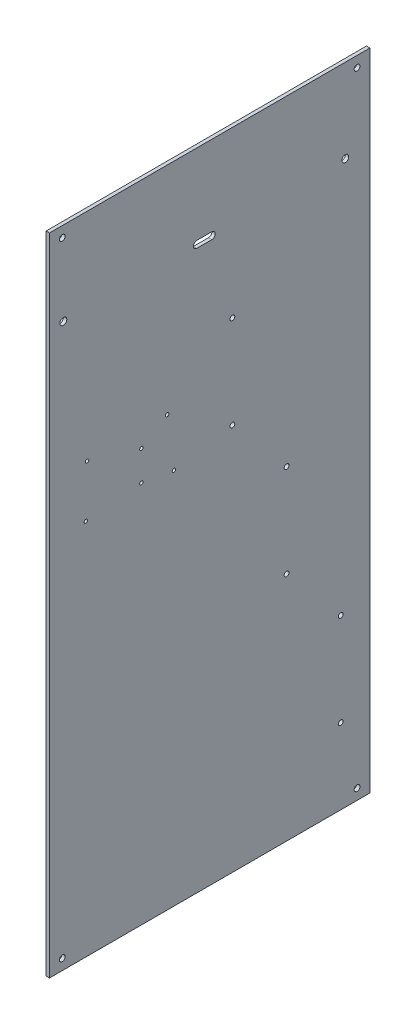
ISO-10303-21;
HEADER;
FILE_DESCRIPTION(('STEP AP214'),'2;1');
FILE_NAME('part.step','',(''),(''),'','','');
FILE_SCHEMA(('AUTOMOTIVE_DESIGN { 1 0 10303 214 1 1 1 1 }'));
ENDSEC;
DATA;
#1=APPLICATION_CONTEXT('core data for automotive mechanical design processes');
#2=APPLICATION_PROTOCOL_DEFINITION('international standard','automotive_design',2000,#1);
#3=PRODUCT_CONTEXT('',#1,'mechanical');
#4=PRODUCT('Part','Part','',(#3));
#5=PRODUCT_RELATED_PRODUCT_CATEGORY('part','',(#4));
#6=PRODUCT_DEFINITION_FORMATION('','',#4);
#7=PRODUCT_DEFINITION_CONTEXT('part definition',#1,'design');
#8=PRODUCT_DEFINITION('design','',#6,#7);
#9=PRODUCT_DEFINITION_SHAPE('','',#8);
#10=(LENGTH_UNIT() NAMED_UNIT(*) SI_UNIT(.MILLI.,.METRE.));
#11=(NAMED_UNIT(*) PLANE_ANGLE_UNIT() SI_UNIT($,.RADIAN.));
#12=(NAMED_UNIT(*) SI_UNIT($,.STERADIAN.) SOLID_ANGLE_UNIT());
#13=UNCERTAINTY_MEASURE_WITH_UNIT(LENGTH_MEASURE(1.E-05),#10,'distance_accuracy_value','');
#14=(GEOMETRIC_REPRESENTATION_CONTEXT(3) GLOBAL_UNCERTAINTY_ASSIGNED_CONTEXT((#13)) GLOBAL_UNIT_ASSIGNED_CONTEXT((#10,
#11,#12)) REPRESENTATION_CONTEXT('',''));
#15=CARTESIAN_POINT('',(0.,0.,0.));
#16=DIRECTION('',(0.,0.,1.));
#17=DIRECTION('',(1.,0.,0.));
#18=AXIS2_PLACEMENT_3D('',#15,#16,#17);
#19=CARTESIAN_POINT('',(-1.5875,-302.1,-150.));
#20=DIRECTION('',(0.,0.,-1.));
#21=DIRECTION('',(-1.,0.,0.));
#22=AXIS2_PLACEMENT_3D('',#19,#20,#21);
#23=PLANE('',#22);
#24=DIRECTION('',(1.,0.,0.));
#25=VECTOR('',#24,1.);
#26=CARTESIAN_POINT('',(-1.5875,302.1,-150.));
#27=LINE('',#26,#25);
#28=CARTESIAN_POINT('',(-1.5875,302.1,-150.));
#29=VERTEX_POINT('',#28);
#30=CARTESIAN_POINT('',(1.5875,302.1,-150.));
#31=VERTEX_POINT('',#30);
#32=EDGE_CURVE('E36',#29,#31,#27,.T.);
#33=ORIENTED_EDGE('',*,*,#32,.T.);
#34=DIRECTION('',(0.,1.,0.));
#35=VECTOR('',#34,1.);
#36=CARTESIAN_POINT('',(1.5875,-302.1,-150.));
#37=LINE('',#36,#35);
#38=CARTESIAN_POINT('',(1.5875,-302.1,-150.));
#39=VERTEX_POINT('',#38);
#40=EDGE_CURVE('E238',#39,#31,#37,.T.);
#41=ORIENTED_EDGE('',*,*,#40,.F.);
#42=DIRECTION('',(1.,0.,0.));
#43=VECTOR('',#42,1.);
#44=CARTESIAN_POINT('',(-1.5875,-302.1,-150.));
#45=LINE('',#44,#43);
#46=CARTESIAN_POINT('',(-1.5875,-302.1,-150.));
#47=VERTEX_POINT('',#46);
#48=EDGE_CURVE('E11',#47,#39,#45,.T.);
#49=ORIENTED_EDGE('',*,*,#48,.F.);
#50=DIRECTION('',(0.,1.,0.));
#51=VECTOR('',#50,1.);
#52=CARTESIAN_POINT('',(-1.5875,-302.1,-150.));
#53=LINE('',#52,#51);
#54=EDGE_CURVE('E250',#47,#29,#53,.T.);
#55=ORIENTED_EDGE('',*,*,#54,.T.);
#56=EDGE_LOOP('',(#33,#41,#49,#55));
#57=FACE_BOUND('',#56,.T.);
#58=ADVANCED_FACE('F33',(#57),#23,.T.);
#59=CARTESIAN_POINT('',(-1.5875,-302.1,150.));
#60=DIRECTION('',(0.,-1.,0.));
#61=DIRECTION('',(0.,0.,-1.));
#62=AXIS2_PLACEMENT_3D('',#59,#60,#61);
#63=PLANE('',#62);
#64=ORIENTED_EDGE('',*,*,#48,.T.);
#65=DIRECTION('',(0.,0.,-1.));
#66=VECTOR('',#65,1.);
#67=CARTESIAN_POINT('',(1.5875,-302.1,150.));
#68=LINE('',#67,#66);
#69=CARTESIAN_POINT('',(1.5875,-302.1,150.));
#70=VERTEX_POINT('',#69);
#71=EDGE_CURVE('E247',#70,#39,#68,.T.);
#72=ORIENTED_EDGE('',*,*,#71,.F.);
#73=DIRECTION('',(1.,0.,0.));
#74=VECTOR('',#73,1.);
#75=CARTESIAN_POINT('',(-1.5875,-302.1,150.));
#76=LINE('',#75,#74);
#77=CARTESIAN_POINT('',(-1.5875,-302.1,150.));
#78=VERTEX_POINT('',#77);
#79=EDGE_CURVE('E41',#78,#70,#76,.T.);
#80=ORIENTED_EDGE('',*,*,#79,.F.);
#81=DIRECTION('',(0.,0.,-1.));
#82=VECTOR('',#81,1.);
#83=CARTESIAN_POINT('',(-1.5875,-302.1,150.));
#84=LINE('',#83,#82);
#85=EDGE_CURVE('E259',#78,#47,#84,.T.);
#86=ORIENTED_EDGE('',*,*,#85,.T.);
#87=EDGE_LOOP('',(#64,#72,#80,#86));
#88=FACE_BOUND('',#87,.T.);
#89=ADVANCED_FACE('F274',(#88),#63,.T.);
#90=CARTESIAN_POINT('',(-1.5875,-302.1,150.));
#91=DIRECTION('',(0.,0.,1.));
#92=DIRECTION('',(1.,0.,0.));
#93=AXIS2_PLACEMENT_3D('',#90,#91,#92);
#94=PLANE('',#93);
#95=ORIENTED_EDGE('',*,*,#79,.T.);
#96=DIRECTION('',(0.,-1.,0.));
#97=VECTOR('',#96,1.);
#98=CARTESIAN_POINT('',(1.5875,-302.1,150.));
#99=LINE('',#98,#97);
#100=CARTESIAN_POINT('',(1.5875,302.1,150.));
#101=VERTEX_POINT('',#100);
#102=EDGE_CURVE('E244',#101,#70,#99,.T.);
#103=ORIENTED_EDGE('',*,*,#102,.F.);
#104=DIRECTION('',(1.,0.,0.));
#105=VECTOR('',#104,1.);
#106=CARTESIAN_POINT('',(-1.5875,302.1,150.));
#107=LINE('',#106,#105);
#108=CARTESIAN_POINT('',(-1.5875,302.1,150.));
#109=VERTEX_POINT('',#108);
#110=EDGE_CURVE('E262',#109,#101,#107,.T.);
#111=ORIENTED_EDGE('',*,*,#110,.F.);
#112=DIRECTION('',(0.,-1.,0.));
#113=VECTOR('',#112,1.);
#114=CARTESIAN_POINT('',(-1.5875,-302.1,150.));
#115=LINE('',#114,#113);
#116=EDGE_CURVE('E256',#109,#78,#115,.T.);
#117=ORIENTED_EDGE('',*,*,#116,.T.);
#118=EDGE_LOOP('',(#95,#103,#111,#117));
#119=FACE_BOUND('',#118,.T.);
#120=ADVANCED_FACE('F280',(#119),#94,.T.);
#121=CARTESIAN_POINT('',(-1.5875,302.1,150.));
#122=DIRECTION('',(0.,1.,0.));
#123=DIRECTION('',(0.,0.,1.));
#124=AXIS2_PLACEMENT_3D('',#121,#122,#123);
#125=PLANE('',#124);
#126=ORIENTED_EDGE('',*,*,#110,.T.);
#127=DIRECTION('',(0.,0.,1.));
#128=VECTOR('',#127,1.);
#129=CARTESIAN_POINT('',(1.5875,302.1,150.));
#130=LINE('',#129,#128);
#131=EDGE_CURVE('E241',#31,#101,#130,.T.);
#132=ORIENTED_EDGE('',*,*,#131,.F.);
#133=ORIENTED_EDGE('',*,*,#32,.F.);
#134=DIRECTION('',(0.,0.,1.));
#135=VECTOR('',#134,1.);
#136=CARTESIAN_POINT('',(-1.5875,302.1,150.));
#137=LINE('',#136,#135);
#138=EDGE_CURVE('E253',#29,#109,#137,.T.);
#139=ORIENTED_EDGE('',*,*,#138,.T.);
#140=EDGE_LOOP('',(#126,#132,#133,#139));
#141=FACE_BOUND('',#140,.T.);
#142=ADVANCED_FACE('F269',(#141),#125,.T.);
#143=CARTESIAN_POINT('',(-1.5875,0.,0.));
#144=DIRECTION('',(-1.,0.,0.));
#145=DIRECTION('',(0.,0.,1.));
#146=AXIS2_PLACEMENT_3D('',#143,#144,#145);
#147=PLANE('',#146);
#148=CARTESIAN_POINT('',(-1.5875,99.5600057879315,39.83));
#149=DIRECTION('',(1.,0.,0.));
#150=DIRECTION('',(0.,0.,-1.));
#151=AXIS2_PLACEMENT_3D('',#148,#149,#150);
#152=CIRCLE('',#151,1.59999999999999);
#153=CARTESIAN_POINT('',(-1.5875,99.5600057879315,38.23));
#154=VERTEX_POINT('',#153);
#155=EDGE_CURVE('E176',#154,#154,#152,.T.);
#156=ORIENTED_EDGE('',*,*,#155,.T.);
#157=EDGE_LOOP('',(#156));
#158=FACE_BOUND('',#157,.T.);
#159=CARTESIAN_POINT('',(-1.5875,60.6000000000001,-21.25));
#160=DIRECTION('',(1.,0.,0.));
#161=DIRECTION('',(0.,0.,-1.));
#162=AXIS2_PLACEMENT_3D('',#159,#160,#161);
#163=CIRCLE('',#162,2.25);
#164=CARTESIAN_POINT('',(-1.5875,60.6000000000001,-23.5));
#165=VERTEX_POINT('',#164);
#166=EDGE_CURVE('E177',#165,#165,#163,.T.);
#167=ORIENTED_EDGE('',*,*,#166,.T.);
#168=EDGE_LOOP('',(#167));
#169=FACE_BOUND('',#168,.T.);
#170=CARTESIAN_POINT('',(-1.5875,147.6,-21.25));
#171=DIRECTION('',(1.,0.,0.));
#172=DIRECTION('',(0.,0.,-1.));
#173=AXIS2_PLACEMENT_3D('',#170,#171,#172);
#174=CIRCLE('',#173,2.25);
#175=CARTESIAN_POINT('',(-1.5875,147.6,-23.5));
#176=VERTEX_POINT('',#175);
#177=EDGE_CURVE('E164',#176,#176,#174,.T.);
#178=ORIENTED_EDGE('',*,*,#177,.T.);
#179=EDGE_LOOP('',(#178));
#180=FACE_BOUND('',#179,.T.);
#181=CARTESIAN_POINT('',(-1.5875,1.60000000000003,-72.0000000000001));
#182=DIRECTION('',(1.,0.,0.));
#183=DIRECTION('',(0.,0.,-1.));
#184=AXIS2_PLACEMENT_3D('',#181,#182,#183);
#185=CIRCLE('',#184,2.24999999999998);
#186=CARTESIAN_POINT('',(-1.5875,1.60000000000003,-74.2500000000001));
#187=VERTEX_POINT('',#186);
#188=EDGE_CURVE('E165',#187,#187,#185,.T.);
#189=ORIENTED_EDGE('',*,*,#188,.T.);
#190=EDGE_LOOP('',(#189));
#191=FACE_BOUND('',#190,.T.);
#192=CARTESIAN_POINT('',(-1.5875,99.5600057879315,114.76));
#193=DIRECTION('',(1.,0.,0.));
#194=DIRECTION('',(0.,0.,-1.));
#195=AXIS2_PLACEMENT_3D('',#192,#193,#194);
#196=CIRCLE('',#195,1.60000000000002);
#197=CARTESIAN_POINT('',(-1.5875,99.5600057879315,113.16));
#198=VERTEX_POINT('',#197);
#199=EDGE_CURVE('E200',#198,#198,#196,.T.);
#200=ORIENTED_EDGE('',*,*,#199,.T.);
#201=EDGE_LOOP('',(#200));
#202=FACE_BOUND('',#201,.T.);
#203=CARTESIAN_POINT('',(-1.5875,56.3800057879315,63.96));
#204=DIRECTION('',(1.,0.,0.));
#205=DIRECTION('',(0.,0.,-1.));
#206=AXIS2_PLACEMENT_3D('',#203,#204,#205);
#207=CIRCLE('',#206,1.60000000000003);
#208=CARTESIAN_POINT('',(-1.5875,56.3800057879315,62.36));
#209=VERTEX_POINT('',#208);
#210=EDGE_CURVE('E201',#209,#209,#207,.T.);
#211=ORIENTED_EDGE('',*,*,#210,.T.);
#212=EDGE_LOOP('',(#211));
#213=FACE_BOUND('',#212,.T.);
#214=CARTESIAN_POINT('',(-1.5875,84.3200057879315,63.96));
#215=DIRECTION('',(1.,0.,0.));
#216=DIRECTION('',(0.,0.,-1.));
#217=AXIS2_PLACEMENT_3D('',#214,#215,#216);
#218=CIRCLE('',#217,1.60000000000004);
#219=CARTESIAN_POINT('',(-1.5875,84.3200057879315,62.3599999999999));
#220=VERTEX_POINT('',#219);
#221=EDGE_CURVE('E188',#220,#220,#218,.T.);
#222=ORIENTED_EDGE('',*,*,#221,.T.);
#223=EDGE_LOOP('',(#222));
#224=FACE_BOUND('',#223,.T.);
#225=CARTESIAN_POINT('',(-1.5875,51.3000057879315,33.48));
#226=DIRECTION('',(1.,0.,0.));
#227=DIRECTION('',(0.,0.,-1.));
#228=AXIS2_PLACEMENT_3D('',#225,#226,#227);
#229=CIRCLE('',#228,1.6);
#230=CARTESIAN_POINT('',(-1.5875,51.3000057879315,31.88));
#231=VERTEX_POINT('',#230);
#232=EDGE_CURVE('E189',#231,#231,#229,.T.);
#233=ORIENTED_EDGE('',*,*,#232,.T.);
#234=EDGE_LOOP('',(#233));
#235=FACE_BOUND('',#234,.T.);
#236=CARTESIAN_POINT('',(-1.5875,223.8634,12.));
#237=DIRECTION('',(1.,0.,0.));
#238=DIRECTION('',(0.,0.,-1.));
#239=AXIS2_PLACEMENT_3D('',#236,#237,#238);
#240=CIRCLE('',#239,3.19999999999998);
#241=CARTESIAN_POINT('',(-1.5875,227.0634,12.));
#242=VERTEX_POINT('',#241);
#243=CARTESIAN_POINT('',(-1.5875,220.6634,12.));
#244=VERTEX_POINT('',#243);
#245=EDGE_CURVE('E118',#242,#244,#240,.T.);
#246=ORIENTED_EDGE('',*,*,#245,.T.);
#247=DIRECTION('',(0.,0.,-1.));
#248=VECTOR('',#247,1.);
#249=CARTESIAN_POINT('',(-1.5875,220.6634,12.));
#250=LINE('',#249,#248);
#251=CARTESIAN_POINT('',(-1.5875,220.6634,-2.00000000000003));
#252=VERTEX_POINT('',#251);
#253=EDGE_CURVE('E124',#244,#252,#250,.T.);
#254=ORIENTED_EDGE('',*,*,#253,.T.);
#255=CARTESIAN_POINT('',(-1.5875,223.8634,-2.00000000000003));
#256=DIRECTION('',(1.,0.,0.));
#257=DIRECTION('',(0.,0.,-1.));
#258=AXIS2_PLACEMENT_3D('',#255,#256,#257);
#259=CIRCLE('',#258,3.19999999999998);
#260=CARTESIAN_POINT('',(-1.5875,227.0634,-2.00000000000003));
#261=VERTEX_POINT('',#260);
#262=EDGE_CURVE('E49',#252,#261,#259,.T.);
#263=ORIENTED_EDGE('',*,*,#262,.T.);
#264=DIRECTION('',(0.,0.,1.));
#265=VECTOR('',#264,1.);
#266=CARTESIAN_POINT('',(-1.5875,227.0634,12.));
#267=LINE('',#266,#265);
#268=EDGE_CURVE('E127',#261,#242,#267,.T.);
#269=ORIENTED_EDGE('',*,*,#268,.T.);
#270=EDGE_LOOP('',(#246,#254,#263,#269));
#271=FACE_BOUND('',#270,.T.);
#272=CARTESIAN_POINT('',(-1.5875,223.8634,-127.));
#273=DIRECTION('',(1.,0.,0.));
#274=DIRECTION('',(0.,0.,-1.));
#275=AXIS2_PLACEMENT_3D('',#272,#273,#274);
#276=CIRCLE('',#275,3.20000000000001);
#277=CARTESIAN_POINT('',(-1.5875,223.8634,-130.2));
#278=VERTEX_POINT('',#277);
#279=EDGE_CURVE('E146',#278,#278,#276,.T.);
#280=ORIENTED_EDGE('',*,*,#279,.T.);
#281=EDGE_LOOP('',(#280));
#282=FACE_BOUND('',#281,.T.);
#283=CARTESIAN_POINT('',(-1.5875,-85.4,-72.0000000000001));
#284=DIRECTION('',(1.,0.,0.));
#285=DIRECTION('',(0.,0.,-1.));
#286=AXIS2_PLACEMENT_3D('',#283,#284,#285);
#287=CIRCLE('',#286,2.25000000000001);
#288=CARTESIAN_POINT('',(-1.5875,-85.4,-74.2500000000001));
#289=VERTEX_POINT('',#288);
#290=EDGE_CURVE('E152',#289,#289,#287,.T.);
#291=ORIENTED_EDGE('',*,*,#290,.T.);
#292=EDGE_LOOP('',(#291));
#293=FACE_BOUND('',#292,.T.);
#294=CARTESIAN_POINT('',(-1.5875,-144.4,-122.75));
#295=DIRECTION('',(1.,0.,0.));
#296=DIRECTION('',(0.,0.,-1.));
#297=AXIS2_PLACEMENT_3D('',#294,#295,#296);
#298=CIRCLE('',#297,2.25);
#299=CARTESIAN_POINT('',(-1.5875,-144.4,-125.));
#300=VERTEX_POINT('',#299);
#301=EDGE_CURVE('E153',#300,#300,#298,.T.);
#302=ORIENTED_EDGE('',*,*,#301,.T.);
#303=EDGE_LOOP('',(#302));
#304=FACE_BOUND('',#303,.T.);
#305=CARTESIAN_POINT('',(-1.5875,-231.4,-122.75));
#306=DIRECTION('',(1.,0.,0.));
#307=DIRECTION('',(0.,0.,-1.));
#308=AXIS2_PLACEMENT_3D('',#305,#306,#307);
#309=CIRCLE('',#308,2.25);
#310=CARTESIAN_POINT('',(-1.5875,-231.4,-125.));
#311=VERTEX_POINT('',#310);
#312=EDGE_CURVE('E138',#311,#311,#309,.T.);
#313=ORIENTED_EDGE('',*,*,#312,.T.);
#314=EDGE_LOOP('',(#313));
#315=FACE_BOUND('',#314,.T.);
#316=CARTESIAN_POINT('',(-1.5875,223.8634,137.));
#317=DIRECTION('',(1.,0.,0.));
#318=DIRECTION('',(0.,0.,-1.));
#319=AXIS2_PLACEMENT_3D('',#316,#317,#318);
#320=CIRCLE('',#319,3.20000000000001);
#321=CARTESIAN_POINT('',(-1.5875,223.8634,133.8));
#322=VERTEX_POINT('',#321);
#323=EDGE_CURVE('E139',#322,#322,#320,.T.);
#324=ORIENTED_EDGE('',*,*,#323,.T.);
#325=EDGE_LOOP('',(#324));
#326=FACE_BOUND('',#325,.T.);
#327=CARTESIAN_POINT('',(-1.5875,51.3000057879315,116.03));
#328=DIRECTION('',(1.,0.,0.));
#329=DIRECTION('',(0.,0.,-1.));
#330=AXIS2_PLACEMENT_3D('',#327,#328,#329);
#331=CIRCLE('',#330,1.60000000000001);
#332=CARTESIAN_POINT('',(-1.5875,51.3000057879315,114.43));
#333=VERTEX_POINT('',#332);
#334=EDGE_CURVE('E211',#333,#333,#331,.T.);
#335=ORIENTED_EDGE('',*,*,#334,.T.);
#336=EDGE_LOOP('',(#335));
#337=FACE_BOUND('',#336,.T.);
#338=CARTESIAN_POINT('',(-1.5875,-292.1,138.));
#339=DIRECTION('',(1.,0.,0.));
#340=DIRECTION('',(0.,0.,1.));
#341=AXIS2_PLACEMENT_3D('',#338,#339,#340);
#342=CIRCLE('',#341,2.70000000000001);
#343=CARTESIAN_POINT('',(-1.5875,-292.1,140.7));
#344=VERTEX_POINT('',#343);
#345=EDGE_CURVE('E226',#344,#344,#342,.T.);
#346=ORIENTED_EDGE('',*,*,#345,.T.);
#347=EDGE_LOOP('',(#346));
#348=FACE_BOUND('',#347,.T.);
#349=CARTESIAN_POINT('',(-1.5875,-292.1,-138.));
#350=DIRECTION('',(1.,0.,0.));
#351=DIRECTION('',(0.,0.,-1.));
#352=AXIS2_PLACEMENT_3D('',#349,#350,#351);
#353=CIRCLE('',#352,2.70000000000001);
#354=CARTESIAN_POINT('',(-1.5875,-292.1,-140.7));
#355=VERTEX_POINT('',#354);
#356=EDGE_CURVE('E219',#355,#355,#353,.T.);
#357=ORIENTED_EDGE('',*,*,#356,.T.);
#358=EDGE_LOOP('',(#357));
#359=FACE_BOUND('',#358,.T.);
#360=CARTESIAN_POINT('',(-1.5875,292.1,-138.));
#361=DIRECTION('',(1.,0.,0.));
#362=DIRECTION('',(0.,0.,1.));
#363=AXIS2_PLACEMENT_3D('',#360,#361,#362);
#364=CIRCLE('',#363,2.70000000000001);
#365=CARTESIAN_POINT('',(-1.5875,292.1,-135.3));
#366=VERTEX_POINT('',#365);
#367=EDGE_CURVE('E218',#366,#366,#364,.T.);
#368=ORIENTED_EDGE('',*,*,#367,.T.);
#369=EDGE_LOOP('',(#368));
#370=FACE_BOUND('',#369,.T.);
#371=CARTESIAN_POINT('',(-1.5875,292.1,138.));
#372=DIRECTION('',(1.,0.,0.));
#373=DIRECTION('',(0.,0.,-1.));
#374=AXIS2_PLACEMENT_3D('',#371,#372,#373);
#375=CIRCLE('',#374,2.70000000000001);
#376=CARTESIAN_POINT('',(-1.5875,292.1,135.3));
#377=VERTEX_POINT('',#376);
#378=EDGE_CURVE('E235',#377,#377,#375,.T.);
#379=ORIENTED_EDGE('',*,*,#378,.T.);
#380=EDGE_LOOP('',(#379));
#381=FACE_BOUND('',#380,.T.);
#382=ORIENTED_EDGE('',*,*,#54,.F.);
#383=ORIENTED_EDGE('',*,*,#85,.F.);
#384=ORIENTED_EDGE('',*,*,#116,.F.);
#385=ORIENTED_EDGE('',*,*,#138,.F.);
#386=EDGE_LOOP('',(#382,#383,#384,#385));
#387=FACE_BOUND('',#386,.T.);
#388=ADVANCED_FACE('F277',(#158,#169,#180,#191,#202,#213,#224,#235,#271,#282,#293,#304,#315,
#326,#337,#348,#359,#370,#381,#387),#147,.T.);
#389=CARTESIAN_POINT('',(1.5875,0.,0.));
#390=DIRECTION('',(-1.,0.,0.));
#391=DIRECTION('',(0.,0.,1.));
#392=AXIS2_PLACEMENT_3D('',#389,#390,#391);
#393=PLANE('',#392);
#394=CARTESIAN_POINT('',(1.5875,99.5600057879315,39.83));
#395=DIRECTION('',(1.,0.,0.));
#396=DIRECTION('',(0.,0.,-1.));
#397=AXIS2_PLACEMENT_3D('',#394,#395,#396);
#398=CIRCLE('',#397,1.59999999999999);
#399=CARTESIAN_POINT('',(1.5875,99.5600057879315,38.23));
#400=VERTEX_POINT('',#399);
#401=EDGE_CURVE('E173',#400,#400,#398,.T.);
#402=ORIENTED_EDGE('',*,*,#401,.F.);
#403=EDGE_LOOP('',(#402));
#404=FACE_BOUND('',#403,.T.);
#405=CARTESIAN_POINT('',(1.5875,60.6000000000001,-21.25));
#406=DIRECTION('',(1.,0.,0.));
#407=DIRECTION('',(0.,0.,-1.));
#408=AXIS2_PLACEMENT_3D('',#405,#406,#407);
#409=CIRCLE('',#408,2.25);
#410=CARTESIAN_POINT('',(1.5875,60.6000000000001,-23.5));
#411=VERTEX_POINT('',#410);
#412=EDGE_CURVE('E168',#411,#411,#409,.T.);
#413=ORIENTED_EDGE('',*,*,#412,.F.);
#414=EDGE_LOOP('',(#413));
#415=FACE_BOUND('',#414,.T.);
#416=CARTESIAN_POINT('',(1.5875,147.6,-21.25));
#417=DIRECTION('',(1.,0.,0.));
#418=DIRECTION('',(0.,0.,-1.));
#419=AXIS2_PLACEMENT_3D('',#416,#417,#418);
#420=CIRCLE('',#419,2.25);
#421=CARTESIAN_POINT('',(1.5875,147.6,-23.5));
#422=VERTEX_POINT('',#421);
#423=EDGE_CURVE('E161',#422,#422,#420,.T.);
#424=ORIENTED_EDGE('',*,*,#423,.F.);
#425=EDGE_LOOP('',(#424));
#426=FACE_BOUND('',#425,.T.);
#427=CARTESIAN_POINT('',(1.5875,1.60000000000003,-72.0000000000001));
#428=DIRECTION('',(1.,0.,0.));
#429=DIRECTION('',(0.,0.,-1.));
#430=AXIS2_PLACEMENT_3D('',#427,#428,#429);
#431=CIRCLE('',#430,2.24999999999998);
#432=CARTESIAN_POINT('',(1.5875,1.60000000000003,-74.2500000000001));
#433=VERTEX_POINT('',#432);
#434=EDGE_CURVE('E156',#433,#433,#431,.T.);
#435=ORIENTED_EDGE('',*,*,#434,.F.);
#436=EDGE_LOOP('',(#435));
#437=FACE_BOUND('',#436,.T.);
#438=CARTESIAN_POINT('',(1.5875,99.5600057879315,114.76));
#439=DIRECTION('',(1.,0.,0.));
#440=DIRECTION('',(0.,0.,-1.));
#441=AXIS2_PLACEMENT_3D('',#438,#439,#440);
#442=CIRCLE('',#441,1.60000000000002);
#443=CARTESIAN_POINT('',(1.5875,99.5600057879315,113.16));
#444=VERTEX_POINT('',#443);
#445=EDGE_CURVE('E197',#444,#444,#442,.T.);
#446=ORIENTED_EDGE('',*,*,#445,.F.);
#447=EDGE_LOOP('',(#446));
#448=FACE_BOUND('',#447,.T.);
#449=CARTESIAN_POINT('',(1.5875,56.3800057879315,63.96));
#450=DIRECTION('',(1.,0.,0.));
#451=DIRECTION('',(0.,0.,-1.));
#452=AXIS2_PLACEMENT_3D('',#449,#450,#451);
#453=CIRCLE('',#452,1.60000000000003);
#454=CARTESIAN_POINT('',(1.5875,56.3800057879315,62.36));
#455=VERTEX_POINT('',#454);
#456=EDGE_CURVE('E192',#455,#455,#453,.T.);
#457=ORIENTED_EDGE('',*,*,#456,.F.);
#458=EDGE_LOOP('',(#457));
#459=FACE_BOUND('',#458,.T.);
#460=CARTESIAN_POINT('',(1.5875,84.3200057879315,63.96));
#461=DIRECTION('',(1.,0.,0.));
#462=DIRECTION('',(0.,0.,-1.));
#463=AXIS2_PLACEMENT_3D('',#460,#461,#462);
#464=CIRCLE('',#463,1.60000000000004);
#465=CARTESIAN_POINT('',(1.5875,84.3200057879315,62.3599999999999));
#466=VERTEX_POINT('',#465);
#467=EDGE_CURVE('E185',#466,#466,#464,.T.);
#468=ORIENTED_EDGE('',*,*,#467,.F.);
#469=EDGE_LOOP('',(#468));
#470=FACE_BOUND('',#469,.T.);
#471=CARTESIAN_POINT('',(1.5875,51.3000057879315,33.48));
#472=DIRECTION('',(1.,0.,0.));
#473=DIRECTION('',(0.,0.,-1.));
#474=AXIS2_PLACEMENT_3D('',#471,#472,#473);
#475=CIRCLE('',#474,1.6);
#476=CARTESIAN_POINT('',(1.5875,51.3000057879315,31.88));
#477=VERTEX_POINT('',#476);
#478=EDGE_CURVE('E180',#477,#477,#475,.T.);
#479=ORIENTED_EDGE('',*,*,#478,.F.);
#480=EDGE_LOOP('',(#479));
#481=FACE_BOUND('',#480,.T.);
#482=DIRECTION('',(0.,0.,-1.));
#483=VECTOR('',#482,1.);
#484=CARTESIAN_POINT('',(1.5875,220.6634,12.));
#485=LINE('',#484,#483);
#486=CARTESIAN_POINT('',(1.5875,220.6634,12.));
#487=VERTEX_POINT('',#486);
#488=CARTESIAN_POINT('',(1.5875,220.6634,-2.00000000000003));
#489=VERTEX_POINT('',#488);
#490=EDGE_CURVE('E109',#487,#489,#485,.T.);
#491=ORIENTED_EDGE('',*,*,#490,.F.);
#492=CARTESIAN_POINT('',(1.5875,223.8634,12.));
#493=DIRECTION('',(1.,0.,0.));
#494=DIRECTION('',(0.,0.,-1.));
#495=AXIS2_PLACEMENT_3D('',#492,#493,#494);
#496=CIRCLE('',#495,3.19999999999998);
#497=CARTESIAN_POINT('',(1.5875,227.0634,12.));
#498=VERTEX_POINT('',#497);
#499=EDGE_CURVE('E57',#498,#487,#496,.T.);
#500=ORIENTED_EDGE('',*,*,#499,.F.);
#501=DIRECTION('',(0.,0.,1.));
#502=VECTOR('',#501,1.);
#503=CARTESIAN_POINT('',(1.5875,227.0634,12.));
#504=LINE('',#503,#502);
#505=CARTESIAN_POINT('',(1.5875,227.0634,-2.00000000000003));
#506=VERTEX_POINT('',#505);
#507=EDGE_CURVE('E116',#506,#498,#504,.T.);
#508=ORIENTED_EDGE('',*,*,#507,.F.);
#509=CARTESIAN_POINT('',(1.5875,223.8634,-2.00000000000003));
#510=DIRECTION('',(1.,0.,0.));
#511=DIRECTION('',(0.,0.,-1.));
#512=AXIS2_PLACEMENT_3D('',#509,#510,#511);
#513=CIRCLE('',#512,3.19999999999998);
#514=EDGE_CURVE('E100',#489,#506,#513,.T.);
#515=ORIENTED_EDGE('',*,*,#514,.F.);
#516=EDGE_LOOP('',(#491,#500,#508,#515));
#517=FACE_BOUND('',#516,.T.);
#518=CARTESIAN_POINT('',(1.5875,223.8634,-127.));
#519=DIRECTION('',(1.,0.,0.));
#520=DIRECTION('',(0.,0.,-1.));
#521=AXIS2_PLACEMENT_3D('',#518,#519,#520);
#522=CIRCLE('',#521,3.20000000000001);
#523=CARTESIAN_POINT('',(1.5875,223.8634,-130.2));
#524=VERTEX_POINT('',#523);
#525=EDGE_CURVE('E132',#524,#524,#522,.T.);
#526=ORIENTED_EDGE('',*,*,#525,.F.);
#527=EDGE_LOOP('',(#526));
#528=FACE_BOUND('',#527,.T.);
#529=CARTESIAN_POINT('',(1.5875,-85.4,-72.0000000000001));
#530=DIRECTION('',(1.,0.,0.));
#531=DIRECTION('',(0.,0.,-1.));
#532=AXIS2_PLACEMENT_3D('',#529,#530,#531);
#533=CIRCLE('',#532,2.25000000000001);
#534=CARTESIAN_POINT('',(1.5875,-85.4,-74.2500000000001));
#535=VERTEX_POINT('',#534);
#536=EDGE_CURVE('E149',#535,#535,#533,.T.);
#537=ORIENTED_EDGE('',*,*,#536,.F.);
#538=EDGE_LOOP('',(#537));
#539=FACE_BOUND('',#538,.T.);
#540=CARTESIAN_POINT('',(1.5875,-144.4,-122.75));
#541=DIRECTION('',(1.,0.,0.));
#542=DIRECTION('',(0.,0.,-1.));
#543=AXIS2_PLACEMENT_3D('',#540,#541,#542);
#544=CIRCLE('',#543,2.25);
#545=CARTESIAN_POINT('',(1.5875,-144.4,-125.));
#546=VERTEX_POINT('',#545);
#547=EDGE_CURVE('E142',#546,#546,#544,.T.);
#548=ORIENTED_EDGE('',*,*,#547,.F.);
#549=EDGE_LOOP('',(#548));
#550=FACE_BOUND('',#549,.T.);
#551=CARTESIAN_POINT('',(1.5875,-231.4,-122.75));
#552=DIRECTION('',(1.,0.,0.));
#553=DIRECTION('',(0.,0.,-1.));
#554=AXIS2_PLACEMENT_3D('',#551,#552,#553);
#555=CIRCLE('',#554,2.25);
#556=CARTESIAN_POINT('',(1.5875,-231.4,-125.));
#557=VERTEX_POINT('',#556);
#558=EDGE_CURVE('E135',#557,#557,#555,.T.);
#559=ORIENTED_EDGE('',*,*,#558,.F.);
#560=EDGE_LOOP('',(#559));
#561=FACE_BOUND('',#560,.T.);
#562=CARTESIAN_POINT('',(1.5875,223.8634,137.));
#563=DIRECTION('',(1.,0.,0.));
#564=DIRECTION('',(0.,0.,-1.));
#565=AXIS2_PLACEMENT_3D('',#562,#563,#564);
#566=CIRCLE('',#565,3.20000000000001);
#567=CARTESIAN_POINT('',(1.5875,223.8634,133.8));
#568=VERTEX_POINT('',#567);
#569=EDGE_CURVE('E143',#568,#568,#566,.T.);
#570=ORIENTED_EDGE('',*,*,#569,.F.);
#571=EDGE_LOOP('',(#570));
#572=FACE_BOUND('',#571,.T.);
#573=CARTESIAN_POINT('',(1.5875,51.3000057879315,116.03));
#574=DIRECTION('',(1.,0.,0.));
#575=DIRECTION('',(0.,0.,-1.));
#576=AXIS2_PLACEMENT_3D('',#573,#574,#575);
#577=CIRCLE('',#576,1.60000000000001);
#578=CARTESIAN_POINT('',(1.5875,51.3000057879315,114.43));
#579=VERTEX_POINT('',#578);
#580=EDGE_CURVE('E204',#579,#579,#577,.T.);
#581=ORIENTED_EDGE('',*,*,#580,.F.);
#582=EDGE_LOOP('',(#581));
#583=FACE_BOUND('',#582,.T.);
#584=CARTESIAN_POINT('',(1.5875,-292.1,138.));
#585=DIRECTION('',(1.,0.,0.));
#586=DIRECTION('',(0.,0.,1.));
#587=AXIS2_PLACEMENT_3D('',#584,#585,#586);
#588=CIRCLE('',#587,2.70000000000001);
#589=CARTESIAN_POINT('',(1.5875,-292.1,140.7));
#590=VERTEX_POINT('',#589);
#591=EDGE_CURVE('E214',#590,#590,#588,.T.);
#592=ORIENTED_EDGE('',*,*,#591,.F.);
#593=EDGE_LOOP('',(#592));
#594=FACE_BOUND('',#593,.T.);
#595=CARTESIAN_POINT('',(1.5875,-292.1,-138.));
#596=DIRECTION('',(1.,0.,0.));
#597=DIRECTION('',(0.,0.,-1.));
#598=AXIS2_PLACEMENT_3D('',#595,#596,#597);
#599=CIRCLE('',#598,2.70000000000001);
#600=CARTESIAN_POINT('',(1.5875,-292.1,-140.7));
#601=VERTEX_POINT('',#600);
#602=EDGE_CURVE('E223',#601,#601,#599,.T.);
#603=ORIENTED_EDGE('',*,*,#602,.F.);
#604=EDGE_LOOP('',(#603));
#605=FACE_BOUND('',#604,.T.);
#606=CARTESIAN_POINT('',(1.5875,292.1,-138.));
#607=DIRECTION('',(1.,0.,0.));
#608=DIRECTION('',(0.,0.,1.));
#609=AXIS2_PLACEMENT_3D('',#606,#607,#608);
#610=CIRCLE('',#609,2.70000000000001);
#611=CARTESIAN_POINT('',(1.5875,292.1,-135.3));
#612=VERTEX_POINT('',#611);
#613=EDGE_CURVE('E215',#612,#612,#610,.T.);
#614=ORIENTED_EDGE('',*,*,#613,.F.);
#615=EDGE_LOOP('',(#614));
#616=FACE_BOUND('',#615,.T.);
#617=CARTESIAN_POINT('',(1.5875,292.1,138.));
#618=DIRECTION('',(1.,0.,0.));
#619=DIRECTION('',(0.,0.,-1.));
#620=AXIS2_PLACEMENT_3D('',#617,#618,#619);
#621=CIRCLE('',#620,2.70000000000001);
#622=CARTESIAN_POINT('',(1.5875,292.1,135.3));
#623=VERTEX_POINT('',#622);
#624=EDGE_CURVE('E222',#623,#623,#621,.T.);
#625=ORIENTED_EDGE('',*,*,#624,.F.);
#626=EDGE_LOOP('',(#625));
#627=FACE_BOUND('',#626,.T.);
#628=ORIENTED_EDGE('',*,*,#40,.T.);
#629=ORIENTED_EDGE('',*,*,#131,.T.);
#630=ORIENTED_EDGE('',*,*,#102,.T.);
#631=ORIENTED_EDGE('',*,*,#71,.T.);
#632=EDGE_LOOP('',(#628,#629,#630,#631));
#633=FACE_BOUND('',#632,.T.);
#634=ADVANCED_FACE('F113',(#404,#415,#426,#437,#448,#459,#470,#481,#517,#528,#539,#550,#561,
#572,#583,#594,#605,#616,#627,#633),#393,.F.);
#635=CARTESIAN_POINT('',(-1.5875,292.1,138.));
#636=DIRECTION('',(1.,0.,0.));
#637=DIRECTION('',(0.,0.,-1.));
#638=AXIS2_PLACEMENT_3D('',#635,#636,#637);
#639=CYLINDRICAL_SURFACE('',#638,2.70000000000001);
#640=ORIENTED_EDGE('',*,*,#378,.F.);
#641=EDGE_LOOP('',(#640));
#642=FACE_BOUND('',#641,.T.);
#643=ORIENTED_EDGE('',*,*,#624,.T.);
#644=EDGE_LOOP('',(#643));
#645=FACE_BOUND('',#644,.T.);
#646=ADVANCED_FACE('F312',(#642,#645),#639,.F.);
#647=CARTESIAN_POINT('',(-1.5875,292.1,-138.));
#648=DIRECTION('',(1.,0.,0.));
#649=DIRECTION('',(0.,0.,-1.));
#650=AXIS2_PLACEMENT_3D('',#647,#648,#649);
#651=CYLINDRICAL_SURFACE('',#650,2.70000000000001);
#652=ORIENTED_EDGE('',*,*,#367,.F.);
#653=EDGE_LOOP('',(#652));
#654=FACE_BOUND('',#653,.T.);
#655=ORIENTED_EDGE('',*,*,#613,.T.);
#656=EDGE_LOOP('',(#655));
#657=FACE_BOUND('',#656,.T.);
#658=ADVANCED_FACE('F317',(#654,#657),#651,.F.);
#659=CARTESIAN_POINT('',(-1.5875,-292.1,-138.));
#660=DIRECTION('',(1.,0.,0.));
#661=DIRECTION('',(0.,0.,-1.));
#662=AXIS2_PLACEMENT_3D('',#659,#660,#661);
#663=CYLINDRICAL_SURFACE('',#662,2.70000000000001);
#664=ORIENTED_EDGE('',*,*,#356,.F.);
#665=EDGE_LOOP('',(#664));
#666=FACE_BOUND('',#665,.T.);
#667=ORIENTED_EDGE('',*,*,#602,.T.);
#668=EDGE_LOOP('',(#667));
#669=FACE_BOUND('',#668,.T.);
#670=ADVANCED_FACE('F329',(#666,#669),#663,.F.);
#671=CARTESIAN_POINT('',(-1.5875,-292.1,138.));
#672=DIRECTION('',(1.,0.,0.));
#673=DIRECTION('',(0.,0.,-1.));
#674=AXIS2_PLACEMENT_3D('',#671,#672,#673);
#675=CYLINDRICAL_SURFACE('',#674,2.70000000000001);
#676=ORIENTED_EDGE('',*,*,#345,.F.);
#677=EDGE_LOOP('',(#676));
#678=FACE_BOUND('',#677,.T.);
#679=ORIENTED_EDGE('',*,*,#591,.T.);
#680=EDGE_LOOP('',(#679));
#681=FACE_BOUND('',#680,.T.);
#682=ADVANCED_FACE('F339',(#678,#681),#675,.F.);
#683=CARTESIAN_POINT('',(-1.5875,51.3000057879315,116.03));
#684=DIRECTION('',(1.,0.,0.));
#685=DIRECTION('',(0.,0.,-1.));
#686=AXIS2_PLACEMENT_3D('',#683,#684,#685);
#687=CYLINDRICAL_SURFACE('',#686,1.60000000000001);
#688=ORIENTED_EDGE('',*,*,#334,.F.);
#689=EDGE_LOOP('',(#688));
#690=FACE_BOUND('',#689,.T.);
#691=ORIENTED_EDGE('',*,*,#580,.T.);
#692=EDGE_LOOP('',(#691));
#693=FACE_BOUND('',#692,.T.);
#694=ADVANCED_FACE('F349',(#690,#693),#687,.F.);
#695=CARTESIAN_POINT('',(-1.5875,223.8634,137.));
#696=DIRECTION('',(1.,0.,0.));
#697=DIRECTION('',(0.,0.,-1.));
#698=AXIS2_PLACEMENT_3D('',#695,#696,#697);
#699=CYLINDRICAL_SURFACE('',#698,3.20000000000001);
#700=ORIENTED_EDGE('',*,*,#323,.F.);
#701=EDGE_LOOP('',(#700));
#702=FACE_BOUND('',#701,.T.);
#703=ORIENTED_EDGE('',*,*,#569,.T.);
#704=EDGE_LOOP('',(#703));
#705=FACE_BOUND('',#704,.T.);
#706=ADVANCED_FACE('F373',(#702,#705),#699,.F.);
#707=CARTESIAN_POINT('',(-1.5875,-231.4,-122.75));
#708=DIRECTION('',(1.,0.,0.));
#709=DIRECTION('',(0.,0.,-1.));
#710=AXIS2_PLACEMENT_3D('',#707,#708,#709);
#711=CYLINDRICAL_SURFACE('',#710,2.25);
#712=ORIENTED_EDGE('',*,*,#312,.F.);
#713=EDGE_LOOP('',(#712));
#714=FACE_BOUND('',#713,.T.);
#715=ORIENTED_EDGE('',*,*,#558,.T.);
#716=EDGE_LOOP('',(#715));
#717=FACE_BOUND('',#716,.T.);
#718=ADVANCED_FACE('F383',(#714,#717),#711,.F.);
#719=CARTESIAN_POINT('',(-1.5875,-144.4,-122.75));
#720=DIRECTION('',(1.,0.,0.));
#721=DIRECTION('',(0.,0.,-1.));
#722=AXIS2_PLACEMENT_3D('',#719,#720,#721);
#723=CYLINDRICAL_SURFACE('',#722,2.25);
#724=ORIENTED_EDGE('',*,*,#301,.F.);
#725=EDGE_LOOP('',(#724));
#726=FACE_BOUND('',#725,.T.);
#727=ORIENTED_EDGE('',*,*,#547,.T.);
#728=EDGE_LOOP('',(#727));
#729=FACE_BOUND('',#728,.T.);
#730=ADVANCED_FACE('F393',(#726,#729),#723,.F.);
#731=CARTESIAN_POINT('',(-1.5875,-85.4,-72.0000000000001));
#732=DIRECTION('',(1.,0.,0.));
#733=DIRECTION('',(0.,0.,-1.));
#734=AXIS2_PLACEMENT_3D('',#731,#732,#733);
#735=CYLINDRICAL_SURFACE('',#734,2.25000000000001);
#736=ORIENTED_EDGE('',*,*,#290,.F.);
#737=EDGE_LOOP('',(#736));
#738=FACE_BOUND('',#737,.T.);
#739=ORIENTED_EDGE('',*,*,#536,.T.);
#740=EDGE_LOOP('',(#739));
#741=FACE_BOUND('',#740,.T.);
#742=ADVANCED_FACE('F403',(#738,#741),#735,.F.);
#743=CARTESIAN_POINT('',(-1.5875,223.8634,-127.));
#744=DIRECTION('',(1.,0.,0.));
#745=DIRECTION('',(0.,0.,-1.));
#746=AXIS2_PLACEMENT_3D('',#743,#744,#745);
#747=CYLINDRICAL_SURFACE('',#746,3.20000000000001);
#748=ORIENTED_EDGE('',*,*,#279,.F.);
#749=EDGE_LOOP('',(#748));
#750=FACE_BOUND('',#749,.T.);
#751=ORIENTED_EDGE('',*,*,#525,.T.);
#752=EDGE_LOOP('',(#751));
#753=FACE_BOUND('',#752,.T.);
#754=ADVANCED_FACE('F413',(#750,#753),#747,.F.);
#755=CARTESIAN_POINT('',(-1.5875,223.8634,12.));
#756=DIRECTION('',(1.,0.,0.));
#757=DIRECTION('',(0.,0.,-1.));
#758=AXIS2_PLACEMENT_3D('',#755,#756,#757);
#759=CYLINDRICAL_SURFACE('',#758,3.19999999999998);
#760=DIRECTION('',(1.,0.,0.));
#761=VECTOR('',#760,1.);
#762=CARTESIAN_POINT('',(-1.5875,220.6634,12.));
#763=LINE('',#762,#761);
#764=EDGE_CURVE('E106',#244,#487,#763,.T.);
#765=ORIENTED_EDGE('',*,*,#764,.F.);
#766=ORIENTED_EDGE('',*,*,#245,.F.);
#767=DIRECTION('',(1.,0.,0.));
#768=VECTOR('',#767,1.);
#769=CARTESIAN_POINT('',(-1.5875,227.0634,12.));
#770=LINE('',#769,#768);
#771=EDGE_CURVE('E130',#242,#498,#770,.T.);
#772=ORIENTED_EDGE('',*,*,#771,.T.);
#773=ORIENTED_EDGE('',*,*,#499,.T.);
#774=EDGE_LOOP('',(#765,#766,#772,#773));
#775=FACE_BOUND('',#774,.T.);
#776=ADVANCED_FACE('F423',(#775),#759,.F.);
#777=CARTESIAN_POINT('',(-1.5875,227.0634,12.));
#778=DIRECTION('',(0.,1.,0.));
#779=DIRECTION('',(0.,0.,1.));
#780=AXIS2_PLACEMENT_3D('',#777,#778,#779);
#781=PLANE('',#780);
#782=ORIENTED_EDGE('',*,*,#771,.F.);
#783=ORIENTED_EDGE('',*,*,#268,.F.);
#784=DIRECTION('',(1.,0.,0.));
#785=VECTOR('',#784,1.);
#786=CARTESIAN_POINT('',(-1.5875,227.0634,-2.00000000000003));
#787=LINE('',#786,#785);
#788=EDGE_CURVE('E105',#261,#506,#787,.T.);
#789=ORIENTED_EDGE('',*,*,#788,.T.);
#790=ORIENTED_EDGE('',*,*,#507,.T.);
#791=EDGE_LOOP('',(#782,#783,#789,#790));
#792=FACE_BOUND('',#791,.T.);
#793=ADVANCED_FACE('F433',(#792),#781,.F.);
#794=CARTESIAN_POINT('',(-1.5875,223.8634,-2.00000000000003));
#795=DIRECTION('',(1.,0.,0.));
#796=DIRECTION('',(0.,0.,-1.));
#797=AXIS2_PLACEMENT_3D('',#794,#795,#796);
#798=CYLINDRICAL_SURFACE('',#797,3.19999999999998);
#799=ORIENTED_EDGE('',*,*,#788,.F.);
#800=ORIENTED_EDGE('',*,*,#262,.F.);
#801=DIRECTION('',(1.,0.,0.));
#802=VECTOR('',#801,1.);
#803=CARTESIAN_POINT('',(-1.5875,220.6634,-2.00000000000003));
#804=LINE('',#803,#802);
#805=EDGE_CURVE('E96',#252,#489,#804,.T.);
#806=ORIENTED_EDGE('',*,*,#805,.T.);
#807=ORIENTED_EDGE('',*,*,#514,.T.);
#808=EDGE_LOOP('',(#799,#800,#806,#807));
#809=FACE_BOUND('',#808,.T.);
#810=ADVANCED_FACE('F98',(#809),#798,.F.);
#811=CARTESIAN_POINT('',(-1.5875,220.6634,12.));
#812=DIRECTION('',(0.,-1.,0.));
#813=DIRECTION('',(0.,0.,-1.));
#814=AXIS2_PLACEMENT_3D('',#811,#812,#813);
#815=PLANE('',#814);
#816=ORIENTED_EDGE('',*,*,#805,.F.);
#817=ORIENTED_EDGE('',*,*,#253,.F.);
#818=ORIENTED_EDGE('',*,*,#764,.T.);
#819=ORIENTED_EDGE('',*,*,#490,.T.);
#820=EDGE_LOOP('',(#816,#817,#818,#819));
#821=FACE_BOUND('',#820,.T.);
#822=ADVANCED_FACE('F110',(#821),#815,.F.);
#823=CARTESIAN_POINT('',(-1.5875,51.3000057879315,33.48));
#824=DIRECTION('',(1.,0.,0.));
#825=DIRECTION('',(0.,0.,-1.));
#826=AXIS2_PLACEMENT_3D('',#823,#824,#825);
#827=CYLINDRICAL_SURFACE('',#826,1.6);
#828=ORIENTED_EDGE('',*,*,#232,.F.);
#829=EDGE_LOOP('',(#828));
#830=FACE_BOUND('',#829,.T.);
#831=ORIENTED_EDGE('',*,*,#478,.T.);
#832=EDGE_LOOP('',(#831));
#833=FACE_BOUND('',#832,.T.);
#834=ADVANCED_FACE('F459',(#830,#833),#827,.F.);
#835=CARTESIAN_POINT('',(-1.5875,84.3200057879315,63.96));
#836=DIRECTION('',(1.,0.,0.));
#837=DIRECTION('',(0.,0.,-1.));
#838=AXIS2_PLACEMENT_3D('',#835,#836,#837);
#839=CYLINDRICAL_SURFACE('',#838,1.60000000000004);
#840=ORIENTED_EDGE('',*,*,#221,.F.);
#841=EDGE_LOOP('',(#840));
#842=FACE_BOUND('',#841,.T.);
#843=ORIENTED_EDGE('',*,*,#467,.T.);
#844=EDGE_LOOP('',(#843));
#845=FACE_BOUND('',#844,.T.);
#846=ADVANCED_FACE('F468',(#842,#845),#839,.F.);
#847=CARTESIAN_POINT('',(-1.5875,56.3800057879315,63.96));
#848=DIRECTION('',(1.,0.,0.));
#849=DIRECTION('',(0.,0.,-1.));
#850=AXIS2_PLACEMENT_3D('',#847,#848,#849);
#851=CYLINDRICAL_SURFACE('',#850,1.60000000000003);
#852=ORIENTED_EDGE('',*,*,#210,.F.);
#853=EDGE_LOOP('',(#852));
#854=FACE_BOUND('',#853,.T.);
#855=ORIENTED_EDGE('',*,*,#456,.T.);
#856=EDGE_LOOP('',(#855));
#857=FACE_BOUND('',#856,.T.);
#858=ADVANCED_FACE('F478',(#854,#857),#851,.F.);
#859=CARTESIAN_POINT('',(-1.5875,99.5600057879315,114.76));
#860=DIRECTION('',(1.,0.,0.));
#861=DIRECTION('',(0.,0.,-1.));
#862=AXIS2_PLACEMENT_3D('',#859,#860,#861);
#863=CYLINDRICAL_SURFACE('',#862,1.60000000000002);
#864=ORIENTED_EDGE('',*,*,#199,.F.);
#865=EDGE_LOOP('',(#864));
#866=FACE_BOUND('',#865,.T.);
#867=ORIENTED_EDGE('',*,*,#445,.T.);
#868=EDGE_LOOP('',(#867));
#869=FACE_BOUND('',#868,.T.);
#870=ADVANCED_FACE('F488',(#866,#869),#863,.F.);
#871=CARTESIAN_POINT('',(-1.5875,1.60000000000003,-72.0000000000001));
#872=DIRECTION('',(1.,0.,0.));
#873=DIRECTION('',(0.,0.,-1.));
#874=AXIS2_PLACEMENT_3D('',#871,#872,#873);
#875=CYLINDRICAL_SURFACE('',#874,2.24999999999998);
#876=ORIENTED_EDGE('',*,*,#188,.F.);
#877=EDGE_LOOP('',(#876));
#878=FACE_BOUND('',#877,.T.);
#879=ORIENTED_EDGE('',*,*,#434,.T.);
#880=EDGE_LOOP('',(#879));
#881=FACE_BOUND('',#880,.T.);
#882=ADVANCED_FACE('F498',(#878,#881),#875,.F.);
#883=CARTESIAN_POINT('',(-1.5875,147.6,-21.25));
#884=DIRECTION('',(1.,0.,0.));
#885=DIRECTION('',(0.,0.,-1.));
#886=AXIS2_PLACEMENT_3D('',#883,#884,#885);
#887=CYLINDRICAL_SURFACE('',#886,2.25);
#888=ORIENTED_EDGE('',*,*,#177,.F.);
#889=EDGE_LOOP('',(#888));
#890=FACE_BOUND('',#889,.T.);
#891=ORIENTED_EDGE('',*,*,#423,.T.);
#892=EDGE_LOOP('',(#891));
#893=FACE_BOUND('',#892,.T.);
#894=ADVANCED_FACE('F508',(#890,#893),#887,.F.);
#895=CARTESIAN_POINT('',(-1.5875,60.6000000000001,-21.25));
#896=DIRECTION('',(1.,0.,0.));
#897=DIRECTION('',(0.,0.,-1.));
#898=AXIS2_PLACEMENT_3D('',#895,#896,#897);
#899=CYLINDRICAL_SURFACE('',#898,2.25);
#900=ORIENTED_EDGE('',*,*,#166,.F.);
#901=EDGE_LOOP('',(#900));
#902=FACE_BOUND('',#901,.T.);
#903=ORIENTED_EDGE('',*,*,#412,.T.);
#904=EDGE_LOOP('',(#903));
#905=FACE_BOUND('',#904,.T.);
#906=ADVANCED_FACE('F518',(#902,#905),#899,.F.);
#907=CARTESIAN_POINT('',(-1.5875,99.5600057879315,39.83));
#908=DIRECTION('',(1.,0.,0.));
#909=DIRECTION('',(0.,0.,-1.));
#910=AXIS2_PLACEMENT_3D('',#907,#908,#909);
#911=CYLINDRICAL_SURFACE('',#910,1.59999999999999);
#912=ORIENTED_EDGE('',*,*,#155,.F.);
#913=EDGE_LOOP('',(#912));
#914=FACE_BOUND('',#913,.T.);
#915=ORIENTED_EDGE('',*,*,#401,.T.);
#916=EDGE_LOOP('',(#915));
#917=FACE_BOUND('',#916,.T.);
#918=ADVANCED_FACE('F528',(#914,#917),#911,.F.);
#919=CLOSED_SHELL('',(#58,#89,#120,#142,#388,#634,#646,#658,#670,#682,#694,#706,#718,#730,#742,
#754,#776,#793,#810,#822,#834,#846,#858,#870,#882,#894,#906,#918));
#920=MANIFOLD_SOLID_BREP('B2',#919);
#921=ADVANCED_BREP_SHAPE_REPRESENTATION('',(#18,#920),#14);
#922=SHAPE_DEFINITION_REPRESENTATION(#9,#921);
ENDSEC;
END-ISO-10303-21;
